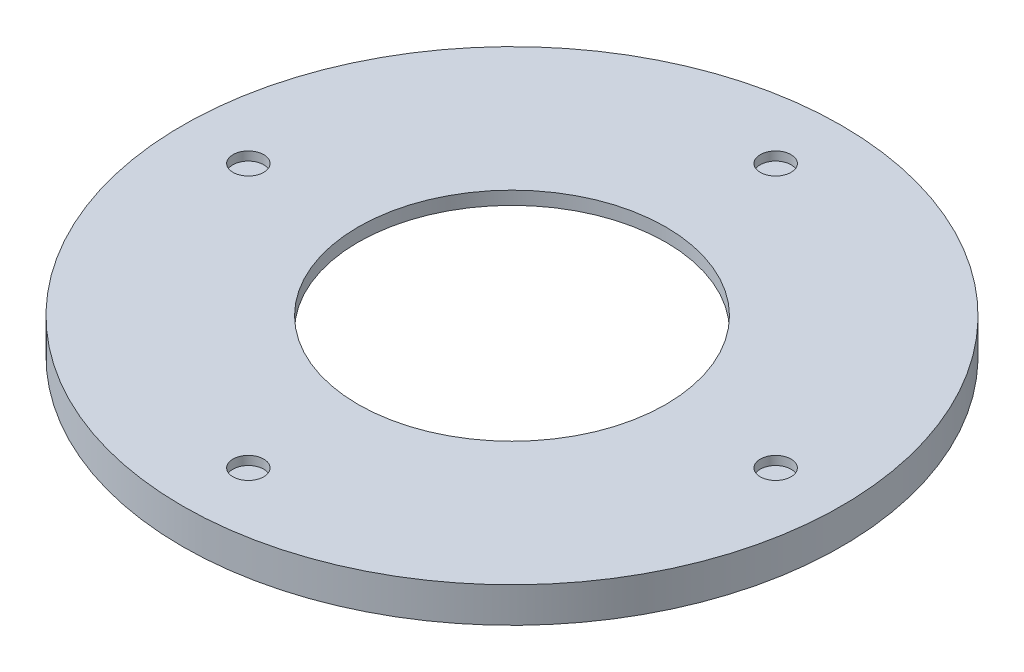
ISO-10303-21;
HEADER;
FILE_DESCRIPTION(('STEP AP214'),'2;1');
FILE_NAME('part.step','',(''),(''),'','','');
FILE_SCHEMA(('AUTOMOTIVE_DESIGN { 1 0 10303 214 1 1 1 1 }'));
ENDSEC;
DATA;
#1=APPLICATION_CONTEXT('core data for automotive mechanical design processes');
#2=APPLICATION_PROTOCOL_DEFINITION('international standard','automotive_design',2000,#1);
#3=PRODUCT_CONTEXT('',#1,'mechanical');
#4=PRODUCT('Part','Part','',(#3));
#5=PRODUCT_RELATED_PRODUCT_CATEGORY('part','',(#4));
#6=PRODUCT_DEFINITION_FORMATION('','',#4);
#7=PRODUCT_DEFINITION_CONTEXT('part definition',#1,'design');
#8=PRODUCT_DEFINITION('design','',#6,#7);
#9=PRODUCT_DEFINITION_SHAPE('','',#8);
#10=(LENGTH_UNIT() NAMED_UNIT(*) SI_UNIT(.MILLI.,.METRE.));
#11=(NAMED_UNIT(*) PLANE_ANGLE_UNIT() SI_UNIT($,.RADIAN.));
#12=(NAMED_UNIT(*) SI_UNIT($,.STERADIAN.) SOLID_ANGLE_UNIT());
#13=UNCERTAINTY_MEASURE_WITH_UNIT(LENGTH_MEASURE(1.E-05),#10,'distance_accuracy_value','');
#14=(GEOMETRIC_REPRESENTATION_CONTEXT(3) GLOBAL_UNCERTAINTY_ASSIGNED_CONTEXT((#13)) GLOBAL_UNIT_ASSIGNED_CONTEXT((#10,
#11,#12)) REPRESENTATION_CONTEXT('',''));
#15=CARTESIAN_POINT('',(0.,0.,0.));
#16=DIRECTION('',(0.,0.,1.));
#17=DIRECTION('',(1.,0.,0.));
#18=AXIS2_PLACEMENT_3D('',#15,#16,#17);
#19=CARTESIAN_POINT('',(0.,4.,0.));
#20=DIRECTION('',(0.,-1.,0.));
#21=DIRECTION('',(0.,0.,-1.));
#22=AXIS2_PLACEMENT_3D('',#19,#20,#21);
#23=CYLINDRICAL_SURFACE('',#22,37.5);
#24=CARTESIAN_POINT('',(0.,4.,0.));
#25=DIRECTION('',(0.,1.,0.));
#26=DIRECTION('',(0.,0.,1.));
#27=AXIS2_PLACEMENT_3D('',#24,#25,#26);
#28=CIRCLE('',#27,37.5);
#29=CARTESIAN_POINT('',(0.,4.,37.5));
#30=VERTEX_POINT('',#29);
#31=EDGE_CURVE('E10',#30,#30,#28,.T.);
#32=ORIENTED_EDGE('',*,*,#31,.F.);
#33=EDGE_LOOP('',(#32));
#34=FACE_BOUND('',#33,.T.);
#35=CARTESIAN_POINT('',(0.,0.,0.));
#36=DIRECTION('',(0.,1.,0.));
#37=DIRECTION('',(0.,0.,1.));
#38=AXIS2_PLACEMENT_3D('',#35,#36,#37);
#39=CIRCLE('',#38,37.5);
#40=CARTESIAN_POINT('',(0.,0.,37.5));
#41=VERTEX_POINT('',#40);
#42=EDGE_CURVE('E34',#41,#41,#39,.T.);
#43=ORIENTED_EDGE('',*,*,#42,.T.);
#44=EDGE_LOOP('',(#43));
#45=FACE_BOUND('',#44,.T.);
#46=ADVANCED_FACE('F31',(#34,#45),#23,.T.);
#47=CARTESIAN_POINT('',(0.,4.,0.));
#48=DIRECTION('',(0.,1.,0.));
#49=DIRECTION('',(0.,0.,1.));
#50=AXIS2_PLACEMENT_3D('',#47,#48,#49);
#51=PLANE('',#50);
#52=CARTESIAN_POINT('',(0.,4.,0.));
#53=DIRECTION('',(0.,-1.,0.));
#54=DIRECTION('',(0.,0.,-1.));
#55=AXIS2_PLACEMENT_3D('',#52,#53,#54);
#56=CIRCLE('',#55,17.5);
#57=CARTESIAN_POINT('',(0.,4.,-17.5));
#58=VERTEX_POINT('',#57);
#59=EDGE_CURVE('E70',#58,#58,#56,.T.);
#60=ORIENTED_EDGE('',*,*,#59,.T.);
#61=EDGE_LOOP('',(#60));
#62=FACE_BOUND('',#61,.T.);
#63=CARTESIAN_POINT('',(0.,4.,-30.));
#64=DIRECTION('',(0.,1.,0.));
#65=DIRECTION('',(0.,0.,1.));
#66=AXIS2_PLACEMENT_3D('',#63,#64,#65);
#67=CIRCLE('',#66,1.75);
#68=CARTESIAN_POINT('',(0.,4.,-28.25));
#69=VERTEX_POINT('',#68);
#70=EDGE_CURVE('E62',#69,#69,#67,.T.);
#71=ORIENTED_EDGE('',*,*,#70,.F.);
#72=EDGE_LOOP('',(#71));
#73=FACE_BOUND('',#72,.T.);
#74=CARTESIAN_POINT('',(30.,4.,0.));
#75=DIRECTION('',(0.,1.,0.));
#76=DIRECTION('',(0.,0.,1.));
#77=AXIS2_PLACEMENT_3D('',#74,#75,#76);
#78=CIRCLE('',#77,1.75);
#79=CARTESIAN_POINT('',(30.,4.,1.75000000000001));
#80=VERTEX_POINT('',#79);
#81=EDGE_CURVE('E56',#80,#80,#78,.T.);
#82=ORIENTED_EDGE('',*,*,#81,.F.);
#83=EDGE_LOOP('',(#82));
#84=FACE_BOUND('',#83,.T.);
#85=CARTESIAN_POINT('',(0.,4.,30.));
#86=DIRECTION('',(0.,1.,0.));
#87=DIRECTION('',(0.,0.,1.));
#88=AXIS2_PLACEMENT_3D('',#85,#86,#87);
#89=CIRCLE('',#88,1.75);
#90=CARTESIAN_POINT('',(0.,4.,31.75));
#91=VERTEX_POINT('',#90);
#92=EDGE_CURVE('E50',#91,#91,#89,.T.);
#93=ORIENTED_EDGE('',*,*,#92,.F.);
#94=EDGE_LOOP('',(#93));
#95=FACE_BOUND('',#94,.T.);
#96=CARTESIAN_POINT('',(-30.,4.,0.));
#97=DIRECTION('',(0.,1.,0.));
#98=DIRECTION('',(0.,0.,1.));
#99=AXIS2_PLACEMENT_3D('',#96,#97,#98);
#100=CIRCLE('',#99,1.75);
#101=CARTESIAN_POINT('',(-30.,4.,1.75000000000001));
#102=VERTEX_POINT('',#101);
#103=EDGE_CURVE('E43',#102,#102,#100,.T.);
#104=ORIENTED_EDGE('',*,*,#103,.F.);
#105=EDGE_LOOP('',(#104));
#106=FACE_BOUND('',#105,.T.);
#107=ORIENTED_EDGE('',*,*,#31,.T.);
#108=EDGE_LOOP('',(#107));
#109=FACE_BOUND('',#108,.T.);
#110=ADVANCED_FACE('F79',(#62,#73,#84,#95,#106,#109),#51,.T.);
#111=CARTESIAN_POINT('',(0.,0.,0.));
#112=DIRECTION('',(0.,1.,0.));
#113=DIRECTION('',(0.,0.,1.));
#114=AXIS2_PLACEMENT_3D('',#111,#112,#113);
#115=PLANE('',#114);
#116=CARTESIAN_POINT('',(0.,0.,0.));
#117=DIRECTION('',(0.,-1.,0.));
#118=DIRECTION('',(0.,0.,-1.));
#119=AXIS2_PLACEMENT_3D('',#116,#117,#118);
#120=CIRCLE('',#119,35.);
#121=CARTESIAN_POINT('',(0.,0.,-35.));
#122=VERTEX_POINT('',#121);
#123=EDGE_CURVE('E67',#122,#122,#120,.T.);
#124=ORIENTED_EDGE('',*,*,#123,.F.);
#125=EDGE_LOOP('',(#124));
#126=FACE_BOUND('',#125,.T.);
#127=ORIENTED_EDGE('',*,*,#42,.F.);
#128=EDGE_LOOP('',(#127));
#129=FACE_BOUND('',#128,.T.);
#130=ADVANCED_FACE('F101',(#126,#129),#115,.F.);
#131=CARTESIAN_POINT('',(-30.,3.,0.));
#132=DIRECTION('',(0.,1.,0.));
#133=DIRECTION('',(0.,0.,1.));
#134=AXIS2_PLACEMENT_3D('',#131,#132,#133);
#135=CYLINDRICAL_SURFACE('',#134,1.75);
#136=CARTESIAN_POINT('',(-30.,3.,0.));
#137=DIRECTION('',(0.,1.,0.));
#138=DIRECTION('',(0.,0.,1.));
#139=AXIS2_PLACEMENT_3D('',#136,#137,#138);
#140=CIRCLE('',#139,1.75);
#141=CARTESIAN_POINT('',(-30.,3.,1.75000000000001));
#142=VERTEX_POINT('',#141);
#143=EDGE_CURVE('E46',#142,#142,#140,.T.);
#144=ORIENTED_EDGE('',*,*,#143,.F.);
#145=EDGE_LOOP('',(#144));
#146=FACE_BOUND('',#145,.T.);
#147=ORIENTED_EDGE('',*,*,#103,.T.);
#148=EDGE_LOOP('',(#147));
#149=FACE_BOUND('',#148,.T.);
#150=ADVANCED_FACE('F104',(#146,#149),#135,.F.);
#151=CARTESIAN_POINT('',(-30.,3.,0.));
#152=DIRECTION('',(0.,1.,0.));
#153=DIRECTION('',(0.,0.,1.));
#154=AXIS2_PLACEMENT_3D('',#151,#152,#153);
#155=PLANE('',#154);
#156=ORIENTED_EDGE('',*,*,#143,.T.);
#157=EDGE_LOOP('',(#156));
#158=FACE_BOUND('',#157,.T.);
#159=ADVANCED_FACE('F118',(#158),#155,.T.);
#160=CARTESIAN_POINT('',(0.,3.,30.));
#161=DIRECTION('',(0.,1.,0.));
#162=DIRECTION('',(0.,0.,1.));
#163=AXIS2_PLACEMENT_3D('',#160,#161,#162);
#164=CYLINDRICAL_SURFACE('',#163,1.75);
#165=CARTESIAN_POINT('',(0.,3.,30.));
#166=DIRECTION('',(0.,1.,0.));
#167=DIRECTION('',(0.,0.,1.));
#168=AXIS2_PLACEMENT_3D('',#165,#166,#167);
#169=CIRCLE('',#168,1.75);
#170=CARTESIAN_POINT('',(0.,3.,31.75));
#171=VERTEX_POINT('',#170);
#172=EDGE_CURVE('E53',#171,#171,#169,.T.);
#173=ORIENTED_EDGE('',*,*,#172,.F.);
#174=EDGE_LOOP('',(#173));
#175=FACE_BOUND('',#174,.T.);
#176=ORIENTED_EDGE('',*,*,#92,.T.);
#177=EDGE_LOOP('',(#176));
#178=FACE_BOUND('',#177,.T.);
#179=ADVANCED_FACE('F122',(#175,#178),#164,.F.);
#180=CARTESIAN_POINT('',(0.,3.,30.));
#181=DIRECTION('',(0.,1.,0.));
#182=DIRECTION('',(0.,0.,1.));
#183=AXIS2_PLACEMENT_3D('',#180,#181,#182);
#184=PLANE('',#183);
#185=ORIENTED_EDGE('',*,*,#172,.T.);
#186=EDGE_LOOP('',(#185));
#187=FACE_BOUND('',#186,.T.);
#188=ADVANCED_FACE('F126',(#187),#184,.T.);
#189=CARTESIAN_POINT('',(30.,3.,0.));
#190=DIRECTION('',(0.,1.,0.));
#191=DIRECTION('',(0.,0.,1.));
#192=AXIS2_PLACEMENT_3D('',#189,#190,#191);
#193=CYLINDRICAL_SURFACE('',#192,1.75);
#194=CARTESIAN_POINT('',(30.,3.,0.));
#195=DIRECTION('',(0.,1.,0.));
#196=DIRECTION('',(0.,0.,1.));
#197=AXIS2_PLACEMENT_3D('',#194,#195,#196);
#198=CIRCLE('',#197,1.75);
#199=CARTESIAN_POINT('',(30.,3.,1.75000000000001));
#200=VERTEX_POINT('',#199);
#201=EDGE_CURVE('E59',#200,#200,#198,.T.);
#202=ORIENTED_EDGE('',*,*,#201,.F.);
#203=EDGE_LOOP('',(#202));
#204=FACE_BOUND('',#203,.T.);
#205=ORIENTED_EDGE('',*,*,#81,.T.);
#206=EDGE_LOOP('',(#205));
#207=FACE_BOUND('',#206,.T.);
#208=ADVANCED_FACE('F130',(#204,#207),#193,.F.);
#209=CARTESIAN_POINT('',(30.,3.,0.));
#210=DIRECTION('',(0.,1.,0.));
#211=DIRECTION('',(0.,0.,1.));
#212=AXIS2_PLACEMENT_3D('',#209,#210,#211);
#213=PLANE('',#212);
#214=ORIENTED_EDGE('',*,*,#201,.T.);
#215=EDGE_LOOP('',(#214));
#216=FACE_BOUND('',#215,.T.);
#217=ADVANCED_FACE('F134',(#216),#213,.T.);
#218=CARTESIAN_POINT('',(0.,3.,-30.));
#219=DIRECTION('',(0.,1.,0.));
#220=DIRECTION('',(0.,0.,1.));
#221=AXIS2_PLACEMENT_3D('',#218,#219,#220);
#222=CYLINDRICAL_SURFACE('',#221,1.75);
#223=CARTESIAN_POINT('',(0.,3.,-30.));
#224=DIRECTION('',(0.,1.,0.));
#225=DIRECTION('',(0.,0.,1.));
#226=AXIS2_PLACEMENT_3D('',#223,#224,#225);
#227=CIRCLE('',#226,1.75);
#228=CARTESIAN_POINT('',(0.,3.,-28.25));
#229=VERTEX_POINT('',#228);
#230=EDGE_CURVE('E41',#229,#229,#227,.T.);
#231=ORIENTED_EDGE('',*,*,#230,.F.);
#232=EDGE_LOOP('',(#231));
#233=FACE_BOUND('',#232,.T.);
#234=ORIENTED_EDGE('',*,*,#70,.T.);
#235=EDGE_LOOP('',(#234));
#236=FACE_BOUND('',#235,.T.);
#237=ADVANCED_FACE('F138',(#233,#236),#222,.F.);
#238=CARTESIAN_POINT('',(0.,3.,-30.));
#239=DIRECTION('',(0.,1.,0.));
#240=DIRECTION('',(0.,0.,1.));
#241=AXIS2_PLACEMENT_3D('',#238,#239,#240);
#242=PLANE('',#241);
#243=ORIENTED_EDGE('',*,*,#230,.T.);
#244=EDGE_LOOP('',(#243));
#245=FACE_BOUND('',#244,.T.);
#246=ADVANCED_FACE('F97',(#245),#242,.T.);
#247=CARTESIAN_POINT('',(0.,2.5,0.));
#248=DIRECTION('',(0.,-1.,0.));
#249=DIRECTION('',(0.,0.,-1.));
#250=AXIS2_PLACEMENT_3D('',#247,#248,#249);
#251=CYLINDRICAL_SURFACE('',#250,35.);
#252=CARTESIAN_POINT('',(0.,2.5,0.));
#253=DIRECTION('',(0.,-1.,0.));
#254=DIRECTION('',(0.,0.,-1.));
#255=AXIS2_PLACEMENT_3D('',#252,#253,#254);
#256=CIRCLE('',#255,35.);
#257=CARTESIAN_POINT('',(0.,2.5,-35.));
#258=VERTEX_POINT('',#257);
#259=EDGE_CURVE('E47',#258,#258,#256,.T.);
#260=ORIENTED_EDGE('',*,*,#259,.F.);
#261=EDGE_LOOP('',(#260));
#262=FACE_BOUND('',#261,.T.);
#263=ORIENTED_EDGE('',*,*,#123,.T.);
#264=EDGE_LOOP('',(#263));
#265=FACE_BOUND('',#264,.T.);
#266=ADVANCED_FACE('F91',(#262,#265),#251,.F.);
#267=CARTESIAN_POINT('',(0.,2.5,0.));
#268=DIRECTION('',(0.,-1.,0.));
#269=DIRECTION('',(0.,0.,-1.));
#270=AXIS2_PLACEMENT_3D('',#267,#268,#269);
#271=PLANE('',#270);
#272=CARTESIAN_POINT('',(0.,2.5,0.));
#273=DIRECTION('',(0.,-1.,0.));
#274=DIRECTION('',(0.,0.,-1.));
#275=AXIS2_PLACEMENT_3D('',#272,#273,#274);
#276=CIRCLE('',#275,17.5);
#277=CARTESIAN_POINT('',(0.,2.5,-17.5));
#278=VERTEX_POINT('',#277);
#279=EDGE_CURVE('E73',#278,#278,#276,.T.);
#280=ORIENTED_EDGE('',*,*,#279,.F.);
#281=EDGE_LOOP('',(#280));
#282=FACE_BOUND('',#281,.T.);
#283=ORIENTED_EDGE('',*,*,#259,.T.);
#284=EDGE_LOOP('',(#283));
#285=FACE_BOUND('',#284,.T.);
#286=ADVANCED_FACE('F85',(#282,#285),#271,.T.);
#287=CARTESIAN_POINT('',(0.,4.,0.));
#288=DIRECTION('',(0.,-1.,0.));
#289=DIRECTION('',(0.,0.,-1.));
#290=AXIS2_PLACEMENT_3D('',#287,#288,#289);
#291=CYLINDRICAL_SURFACE('',#290,17.5);
#292=ORIENTED_EDGE('',*,*,#59,.F.);
#293=EDGE_LOOP('',(#292));
#294=FACE_BOUND('',#293,.T.);
#295=ORIENTED_EDGE('',*,*,#279,.T.);
#296=EDGE_LOOP('',(#295));
#297=FACE_BOUND('',#296,.T.);
#298=ADVANCED_FACE('F82',(#294,#297),#291,.F.);
#299=CLOSED_SHELL('',(#46,#110,#130,#150,#159,#179,#188,#208,#217,#237,#246,#266,#286,#298));
#300=MANIFOLD_SOLID_BREP('B2',#299);
#301=ADVANCED_BREP_SHAPE_REPRESENTATION('',(#18,#300),#14);
#302=SHAPE_DEFINITION_REPRESENTATION(#9,#301);
ENDSEC;
END-ISO-10303-21;
